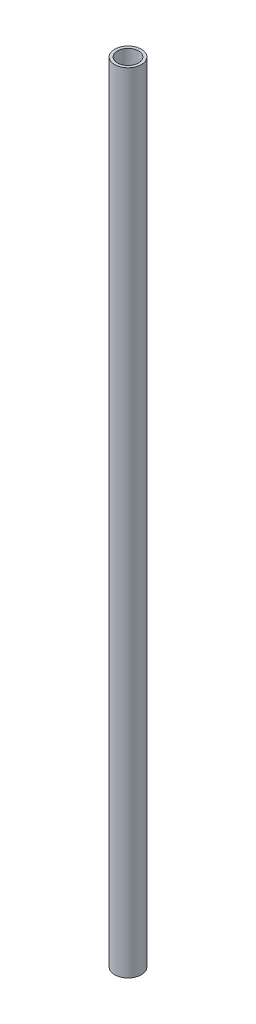
ISO-10303-21;
HEADER;
FILE_DESCRIPTION(('STEP AP214'),'2;1');
FILE_NAME('part.step','',(''),(''),'','','');
FILE_SCHEMA(('AUTOMOTIVE_DESIGN { 1 0 10303 214 1 1 1 1 }'));
ENDSEC;
DATA;
#1=APPLICATION_CONTEXT('core data for automotive mechanical design processes');
#2=APPLICATION_PROTOCOL_DEFINITION('international standard','automotive_design',2000,#1);
#3=PRODUCT_CONTEXT('',#1,'mechanical');
#4=PRODUCT('Part','Part','',(#3));
#5=PRODUCT_RELATED_PRODUCT_CATEGORY('part','',(#4));
#6=PRODUCT_DEFINITION_FORMATION('','',#4);
#7=PRODUCT_DEFINITION_CONTEXT('part definition',#1,'design');
#8=PRODUCT_DEFINITION('design','',#6,#7);
#9=PRODUCT_DEFINITION_SHAPE('','',#8);
#10=(LENGTH_UNIT() NAMED_UNIT(*) SI_UNIT(.MILLI.,.METRE.));
#11=(NAMED_UNIT(*) PLANE_ANGLE_UNIT() SI_UNIT($,.RADIAN.));
#12=(NAMED_UNIT(*) SI_UNIT($,.STERADIAN.) SOLID_ANGLE_UNIT());
#13=UNCERTAINTY_MEASURE_WITH_UNIT(LENGTH_MEASURE(1.E-05),#10,'distance_accuracy_value','');
#14=(GEOMETRIC_REPRESENTATION_CONTEXT(3) GLOBAL_UNCERTAINTY_ASSIGNED_CONTEXT((#13)) GLOBAL_UNIT_ASSIGNED_CONTEXT((#10,
#11,#12)) REPRESENTATION_CONTEXT('',''));
#15=CARTESIAN_POINT('',(0.,0.,0.));
#16=DIRECTION('',(0.,0.,1.));
#17=DIRECTION('',(1.,0.,0.));
#18=AXIS2_PLACEMENT_3D('',#15,#16,#17);
#19=CARTESIAN_POINT('',(0.,750.,0.));
#20=DIRECTION('',(0.,1.,0.));
#21=DIRECTION('',(0.,0.,1.));
#22=AXIS2_PLACEMENT_3D('',#19,#20,#21);
#23=PLANE('',#22);
#24=CARTESIAN_POINT('',(0.,750.,0.));
#25=DIRECTION('',(0.,1.,0.));
#26=DIRECTION('',(0.,0.,1.));
#27=AXIS2_PLACEMENT_3D('',#24,#25,#26);
#28=CIRCLE('',#27,12.7);
#29=CARTESIAN_POINT('',(0.,750.,12.7));
#30=VERTEX_POINT('',#29);
#31=EDGE_CURVE('E10',#30,#30,#28,.T.);
#32=ORIENTED_EDGE('',*,*,#31,.T.);
#33=EDGE_LOOP('',(#32));
#34=FACE_BOUND('',#33,.T.);
#35=CARTESIAN_POINT('',(0.,750.,0.));
#36=DIRECTION('',(0.,1.,0.));
#37=DIRECTION('',(0.,0.,1.));
#38=AXIS2_PLACEMENT_3D('',#35,#36,#37);
#39=CIRCLE('',#38,10.);
#40=CARTESIAN_POINT('',(0.,750.,10.));
#41=VERTEX_POINT('',#40);
#42=EDGE_CURVE('E42',#41,#41,#39,.T.);
#43=ORIENTED_EDGE('',*,*,#42,.F.);
#44=EDGE_LOOP('',(#43));
#45=FACE_BOUND('',#44,.T.);
#46=ADVANCED_FACE('F31',(#34,#45),#23,.T.);
#47=CARTESIAN_POINT('',(0.,0.,0.));
#48=DIRECTION('',(0.,1.,0.));
#49=DIRECTION('',(0.,0.,1.));
#50=AXIS2_PLACEMENT_3D('',#47,#48,#49);
#51=PLANE('',#50);
#52=CARTESIAN_POINT('',(0.,0.,0.));
#53=DIRECTION('',(0.,1.,0.));
#54=DIRECTION('',(0.,0.,1.));
#55=AXIS2_PLACEMENT_3D('',#52,#53,#54);
#56=CIRCLE('',#55,12.7);
#57=CARTESIAN_POINT('',(0.,0.,12.7));
#58=VERTEX_POINT('',#57);
#59=EDGE_CURVE('E35',#58,#58,#56,.T.);
#60=ORIENTED_EDGE('',*,*,#59,.F.);
#61=EDGE_LOOP('',(#60));
#62=FACE_BOUND('',#61,.T.);
#63=CARTESIAN_POINT('',(0.,0.,0.));
#64=DIRECTION('',(0.,1.,0.));
#65=DIRECTION('',(0.,0.,1.));
#66=AXIS2_PLACEMENT_3D('',#63,#64,#65);
#67=CIRCLE('',#66,10.);
#68=CARTESIAN_POINT('',(0.,0.,10.));
#69=VERTEX_POINT('',#68);
#70=EDGE_CURVE('E44',#69,#69,#67,.T.);
#71=ORIENTED_EDGE('',*,*,#70,.T.);
#72=EDGE_LOOP('',(#71));
#73=FACE_BOUND('',#72,.T.);
#74=ADVANCED_FACE('F54',(#62,#73),#51,.F.);
#75=CARTESIAN_POINT('',(0.,750.,0.));
#76=DIRECTION('',(0.,-1.,0.));
#77=DIRECTION('',(0.,0.,-1.));
#78=AXIS2_PLACEMENT_3D('',#75,#76,#77);
#79=CYLINDRICAL_SURFACE('',#78,12.7);
#80=ORIENTED_EDGE('',*,*,#31,.F.);
#81=EDGE_LOOP('',(#80));
#82=FACE_BOUND('',#81,.T.);
#83=ORIENTED_EDGE('',*,*,#59,.T.);
#84=EDGE_LOOP('',(#83));
#85=FACE_BOUND('',#84,.T.);
#86=ADVANCED_FACE('F33',(#82,#85),#79,.T.);
#87=CARTESIAN_POINT('',(0.,750.,0.));
#88=DIRECTION('',(0.,-1.,0.));
#89=DIRECTION('',(0.,0.,-1.));
#90=AXIS2_PLACEMENT_3D('',#87,#88,#89);
#91=CYLINDRICAL_SURFACE('',#90,10.);
#92=ORIENTED_EDGE('',*,*,#42,.T.);
#93=EDGE_LOOP('',(#92));
#94=FACE_BOUND('',#93,.T.);
#95=ORIENTED_EDGE('',*,*,#70,.F.);
#96=EDGE_LOOP('',(#95));
#97=FACE_BOUND('',#96,.T.);
#98=ADVANCED_FACE('F50',(#94,#97),#91,.F.);
#99=CLOSED_SHELL('',(#46,#74,#86,#98));
#100=MANIFOLD_SOLID_BREP('B2',#99);
#101=ADVANCED_BREP_SHAPE_REPRESENTATION('',(#18,#100),#14);
#102=SHAPE_DEFINITION_REPRESENTATION(#9,#101);
ENDSEC;
END-ISO-10303-21;
